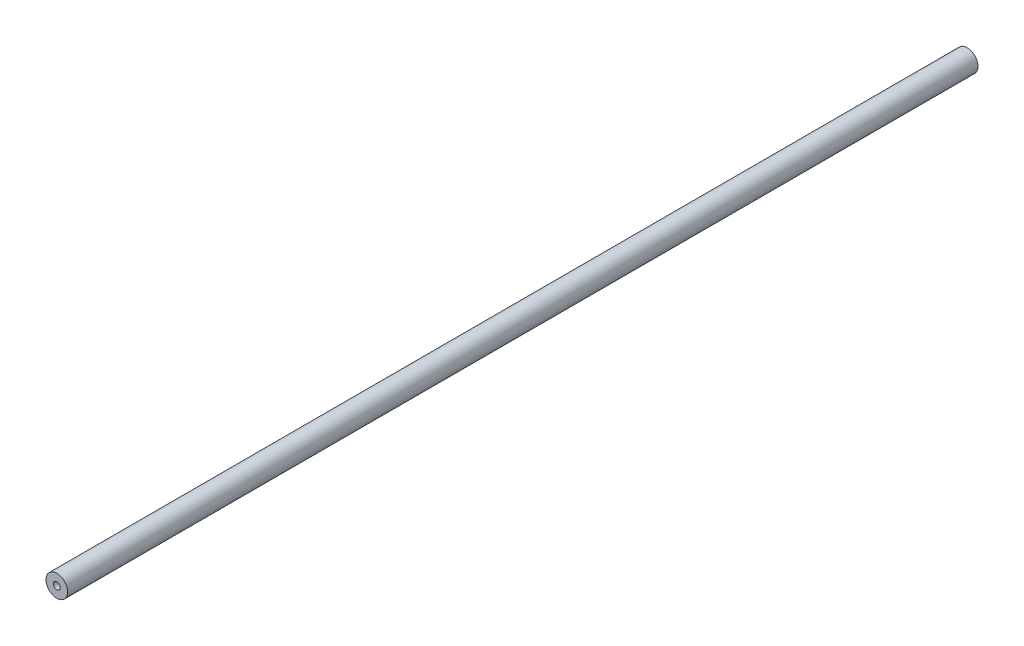
ISO-10303-21;
HEADER;
FILE_DESCRIPTION(('STEP AP214'),'2;1');
FILE_NAME('part.step','',(''),(''),'','','');
FILE_SCHEMA(('AUTOMOTIVE_DESIGN { 1 0 10303 214 1 1 1 1 }'));
ENDSEC;
DATA;
#1=APPLICATION_CONTEXT('core data for automotive mechanical design processes');
#2=APPLICATION_PROTOCOL_DEFINITION('international standard','automotive_design',2000,#1);
#3=PRODUCT_CONTEXT('',#1,'mechanical');
#4=PRODUCT('Part','Part','',(#3));
#5=PRODUCT_RELATED_PRODUCT_CATEGORY('part','',(#4));
#6=PRODUCT_DEFINITION_FORMATION('','',#4);
#7=PRODUCT_DEFINITION_CONTEXT('part definition',#1,'design');
#8=PRODUCT_DEFINITION('design','',#6,#7);
#9=PRODUCT_DEFINITION_SHAPE('','',#8);
#10=(LENGTH_UNIT() NAMED_UNIT(*) SI_UNIT(.MILLI.,.METRE.));
#11=(NAMED_UNIT(*) PLANE_ANGLE_UNIT() SI_UNIT($,.RADIAN.));
#12=(NAMED_UNIT(*) SI_UNIT($,.STERADIAN.) SOLID_ANGLE_UNIT());
#13=UNCERTAINTY_MEASURE_WITH_UNIT(LENGTH_MEASURE(1.E-05),#10,'distance_accuracy_value','');
#14=(GEOMETRIC_REPRESENTATION_CONTEXT(3) GLOBAL_UNCERTAINTY_ASSIGNED_CONTEXT((#13)) GLOBAL_UNIT_ASSIGNED_CONTEXT((#10,
#11,#12)) REPRESENTATION_CONTEXT('',''));
#15=CARTESIAN_POINT('',(0.,0.,0.));
#16=DIRECTION('',(0.,0.,1.));
#17=DIRECTION('',(1.,0.,0.));
#18=AXIS2_PLACEMENT_3D('',#15,#16,#17);
#19=CARTESIAN_POINT('',(0.,0.,533.4));
#20=DIRECTION('',(0.,0.,-1.));
#21=DIRECTION('',(-1.,0.,0.));
#22=AXIS2_PLACEMENT_3D('',#19,#20,#21);
#23=CYLINDRICAL_SURFACE('',#22,6.35);
#24=CARTESIAN_POINT('',(0.,0.,533.4));
#25=DIRECTION('',(0.,0.,1.));
#26=DIRECTION('',(1.,0.,0.));
#27=AXIS2_PLACEMENT_3D('',#24,#25,#26);
#28=CIRCLE('',#27,6.35);
#29=CARTESIAN_POINT('',(6.35,0.,533.4));
#30=VERTEX_POINT('',#29);
#31=EDGE_CURVE('E11',#30,#30,#28,.T.);
#32=ORIENTED_EDGE('',*,*,#31,.F.);
#33=EDGE_LOOP('',(#32));
#34=FACE_BOUND('',#33,.T.);
#35=CARTESIAN_POINT('',(0.,0.,0.));
#36=DIRECTION('',(0.,0.,1.));
#37=DIRECTION('',(1.,0.,0.));
#38=AXIS2_PLACEMENT_3D('',#35,#36,#37);
#39=CIRCLE('',#38,6.35);
#40=CARTESIAN_POINT('',(6.35,0.,0.));
#41=VERTEX_POINT('',#40);
#42=EDGE_CURVE('E52',#41,#41,#39,.T.);
#43=ORIENTED_EDGE('',*,*,#42,.T.);
#44=EDGE_LOOP('',(#43));
#45=FACE_BOUND('',#44,.T.);
#46=ADVANCED_FACE('F49',(#34,#45),#23,.T.);
#47=CARTESIAN_POINT('',(0.,0.,533.4));
#48=DIRECTION('',(0.,0.,1.));
#49=DIRECTION('',(1.,0.,0.));
#50=AXIS2_PLACEMENT_3D('',#47,#48,#49);
#51=PLANE('',#50);
#52=CARTESIAN_POINT('',(0.,0.,533.4));
#53=DIRECTION('',(0.,0.,1.));
#54=DIRECTION('',(1.,0.,0.));
#55=AXIS2_PLACEMENT_3D('',#52,#53,#54);
#56=CIRCLE('',#55,2.0193);
#57=CARTESIAN_POINT('',(2.0193,0.,533.4));
#58=VERTEX_POINT('',#57);
#59=EDGE_CURVE('E74',#58,#58,#56,.T.);
#60=ORIENTED_EDGE('',*,*,#59,.F.);
#61=EDGE_LOOP('',(#60));
#62=FACE_BOUND('',#61,.T.);
#63=ORIENTED_EDGE('',*,*,#31,.T.);
#64=EDGE_LOOP('',(#63));
#65=FACE_BOUND('',#64,.T.);
#66=ADVANCED_FACE('F97',(#62,#65),#51,.T.);
#67=CARTESIAN_POINT('',(0.,0.,0.));
#68=DIRECTION('',(0.,0.,1.));
#69=DIRECTION('',(1.,0.,0.));
#70=AXIS2_PLACEMENT_3D('',#67,#68,#69);
#71=PLANE('',#70);
#72=CARTESIAN_POINT('',(0.,0.,0.));
#73=DIRECTION('',(0.,0.,-1.));
#74=DIRECTION('',(-1.,0.,0.));
#75=AXIS2_PLACEMENT_3D('',#72,#73,#74);
#76=CIRCLE('',#75,2.01929999999999);
#77=CARTESIAN_POINT('',(-2.01929999999999,0.,0.));
#78=VERTEX_POINT('',#77);
#79=EDGE_CURVE('E75',#78,#78,#76,.T.);
#80=ORIENTED_EDGE('',*,*,#79,.F.);
#81=EDGE_LOOP('',(#80));
#82=FACE_BOUND('',#81,.T.);
#83=ORIENTED_EDGE('',*,*,#42,.F.);
#84=EDGE_LOOP('',(#83));
#85=FACE_BOUND('',#84,.T.);
#86=ADVANCED_FACE('F94',(#82,#85),#71,.F.);
#87=CARTESIAN_POINT('',(0.,0.,519.684));
#88=DIRECTION('',(0.,0.,1.));
#89=DIRECTION('',(1.,0.,0.));
#90=AXIS2_PLACEMENT_3D('',#87,#88,#89);
#91=CONICAL_SURFACE('',#90,2.0193,1.02974425867664);
#92=CARTESIAN_POINT('',(0.,0.,518.470682151998));
#93=VERTEX_POINT('',#92);
#94=VERTEX_LOOP('',#93);
#95=FACE_BOUND('',#94,.T.);
#96=CARTESIAN_POINT('',(0.,0.,519.684));
#97=DIRECTION('',(0.,0.,1.));
#98=DIRECTION('',(1.,0.,0.));
#99=AXIS2_PLACEMENT_3D('',#96,#97,#98);
#100=CIRCLE('',#99,2.0193);
#101=CARTESIAN_POINT('',(2.0193,0.,519.684));
#102=VERTEX_POINT('',#101);
#103=EDGE_CURVE('E80',#102,#102,#100,.T.);
#104=ORIENTED_EDGE('',*,*,#103,.T.);
#105=EDGE_LOOP('',(#104));
#106=FACE_BOUND('',#105,.T.);
#107=ADVANCED_FACE('F96',(#95,#106),#91,.F.);
#108=CARTESIAN_POINT('',(0.,0.,533.4));
#109=DIRECTION('',(0.,0.,1.));
#110=DIRECTION('',(1.,0.,0.));
#111=AXIS2_PLACEMENT_3D('',#108,#109,#110);
#112=CYLINDRICAL_SURFACE('',#111,2.0193);
#113=ORIENTED_EDGE('',*,*,#103,.F.);
#114=EDGE_LOOP('',(#113));
#115=FACE_BOUND('',#114,.T.);
#116=ORIENTED_EDGE('',*,*,#59,.T.);
#117=EDGE_LOOP('',(#116));
#118=FACE_BOUND('',#117,.T.);
#119=ADVANCED_FACE('F67',(#115,#118),#112,.F.);
#120=CARTESIAN_POINT('',(0.,0.,13.716));
#121=DIRECTION('',(0.,0.,-1.));
#122=DIRECTION('',(-1.,0.,0.));
#123=AXIS2_PLACEMENT_3D('',#120,#121,#122);
#124=CONICAL_SURFACE('',#123,2.01929999999999,1.02974425867665);
#125=CARTESIAN_POINT('',(0.,0.,14.9293178480024));
#126=VERTEX_POINT('',#125);
#127=VERTEX_LOOP('',#126);
#128=FACE_BOUND('',#127,.T.);
#129=CARTESIAN_POINT('',(0.,0.,13.716));
#130=DIRECTION('',(0.,0.,-1.));
#131=DIRECTION('',(-1.,0.,0.));
#132=AXIS2_PLACEMENT_3D('',#129,#130,#131);
#133=CIRCLE('',#132,2.01929999999999);
#134=CARTESIAN_POINT('',(-2.01929999999999,0.,13.716));
#135=VERTEX_POINT('',#134);
#136=EDGE_CURVE('E71',#135,#135,#133,.T.);
#137=ORIENTED_EDGE('',*,*,#136,.T.);
#138=EDGE_LOOP('',(#137));
#139=FACE_BOUND('',#138,.T.);
#140=ADVANCED_FACE('F63',(#128,#139),#124,.F.);
#141=CARTESIAN_POINT('',(0.,0.,0.));
#142=DIRECTION('',(0.,0.,-1.));
#143=DIRECTION('',(-1.,0.,0.));
#144=AXIS2_PLACEMENT_3D('',#141,#142,#143);
#145=CYLINDRICAL_SURFACE('',#144,2.01929999999999);
#146=ORIENTED_EDGE('',*,*,#136,.F.);
#147=EDGE_LOOP('',(#146));
#148=FACE_BOUND('',#147,.T.);
#149=ORIENTED_EDGE('',*,*,#79,.T.);
#150=EDGE_LOOP('',(#149));
#151=FACE_BOUND('',#150,.T.);
#152=ADVANCED_FACE('F66',(#148,#151),#145,.F.);
#153=CLOSED_SHELL('',(#46,#66,#86,#107,#119,#140,#152));
#154=MANIFOLD_SOLID_BREP('B2',#153);
#155=ADVANCED_BREP_SHAPE_REPRESENTATION('',(#18,#154),#14);
#156=SHAPE_DEFINITION_REPRESENTATION(#9,#155);
ENDSEC;
END-ISO-10303-21;
